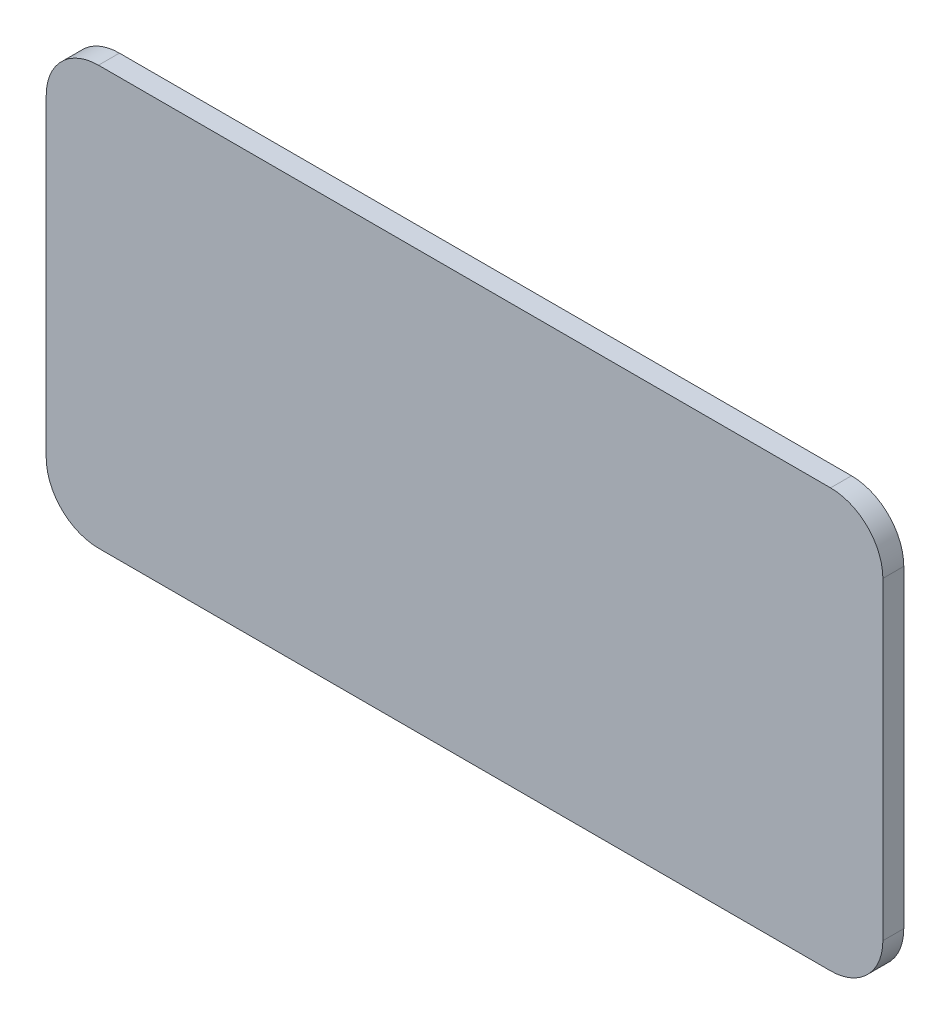
ISO-10303-21;
HEADER;
FILE_DESCRIPTION(('STEP AP214'),'2;1');
FILE_NAME('part.step','',(''),(''),'','','');
FILE_SCHEMA(('AUTOMOTIVE_DESIGN { 1 0 10303 214 1 1 1 1 }'));
ENDSEC;
DATA;
#1=APPLICATION_CONTEXT('core data for automotive mechanical design processes');
#2=APPLICATION_PROTOCOL_DEFINITION('international standard','automotive_design',2000,#1);
#3=PRODUCT_CONTEXT('',#1,'mechanical');
#4=PRODUCT('Part','Part','',(#3));
#5=PRODUCT_RELATED_PRODUCT_CATEGORY('part','',(#4));
#6=PRODUCT_DEFINITION_FORMATION('','',#4);
#7=PRODUCT_DEFINITION_CONTEXT('part definition',#1,'design');
#8=PRODUCT_DEFINITION('design','',#6,#7);
#9=PRODUCT_DEFINITION_SHAPE('','',#8);
#10=(LENGTH_UNIT() NAMED_UNIT(*) SI_UNIT(.MILLI.,.METRE.));
#11=(NAMED_UNIT(*) PLANE_ANGLE_UNIT() SI_UNIT($,.RADIAN.));
#12=(NAMED_UNIT(*) SI_UNIT($,.STERADIAN.) SOLID_ANGLE_UNIT());
#13=UNCERTAINTY_MEASURE_WITH_UNIT(LENGTH_MEASURE(1.E-05),#10,'distance_accuracy_value','');
#14=(GEOMETRIC_REPRESENTATION_CONTEXT(3) GLOBAL_UNCERTAINTY_ASSIGNED_CONTEXT((#13)) GLOBAL_UNIT_ASSIGNED_CONTEXT((#10,
#11,#12)) REPRESENTATION_CONTEXT('',''));
#15=CARTESIAN_POINT('',(0.,0.,0.));
#16=DIRECTION('',(0.,0.,1.));
#17=DIRECTION('',(1.,0.,0.));
#18=AXIS2_PLACEMENT_3D('',#15,#16,#17);
#19=CARTESIAN_POINT('',(40.,-15.,2.));
#20=DIRECTION('',(-1.,0.,0.));
#21=DIRECTION('',(0.,0.,1.));
#22=AXIS2_PLACEMENT_3D('',#19,#20,#21);
#23=PLANE('',#22);
#24=DIRECTION('',(0.,1.,0.));
#25=VECTOR('',#24,1.);
#26=CARTESIAN_POINT('',(40.,-15.,0.));
#27=LINE('',#26,#25);
#28=CARTESIAN_POINT('',(40.,-15.,0.));
#29=VERTEX_POINT('',#28);
#30=CARTESIAN_POINT('',(40.,15.,0.));
#31=VERTEX_POINT('',#30);
#32=EDGE_CURVE('E146',#29,#31,#27,.T.);
#33=ORIENTED_EDGE('',*,*,#32,.T.);
#34=DIRECTION('',(0.,0.,-1.));
#35=VECTOR('',#34,1.);
#36=CARTESIAN_POINT('',(40.,15.,2.));
#37=LINE('',#36,#35);
#38=CARTESIAN_POINT('',(40.,15.,2.));
#39=VERTEX_POINT('',#38);
#40=EDGE_CURVE('E67',#31,#39,#37,.F.);
#41=ORIENTED_EDGE('',*,*,#40,.T.);
#42=DIRECTION('',(0.,1.,0.));
#43=VECTOR('',#42,1.);
#44=CARTESIAN_POINT('',(40.,-15.,2.));
#45=LINE('',#44,#43);
#46=CARTESIAN_POINT('',(40.,-15.,2.));
#47=VERTEX_POINT('',#46);
#48=EDGE_CURVE('E164',#47,#39,#45,.T.);
#49=ORIENTED_EDGE('',*,*,#48,.F.);
#50=DIRECTION('',(0.,0.,-1.));
#51=VECTOR('',#50,1.);
#52=CARTESIAN_POINT('',(40.,-15.,2.));
#53=LINE('',#52,#51);
#54=EDGE_CURVE('E145',#47,#29,#53,.T.);
#55=ORIENTED_EDGE('',*,*,#54,.T.);
#56=EDGE_LOOP('',(#33,#41,#49,#55));
#57=FACE_BOUND('',#56,.T.);
#58=ADVANCED_FACE('F43',(#57),#23,.F.);
#59=CARTESIAN_POINT('',(-40.,20.,2.));
#60=DIRECTION('',(0.,-1.,0.));
#61=DIRECTION('',(0.,0.,-1.));
#62=AXIS2_PLACEMENT_3D('',#59,#60,#61);
#63=PLANE('',#62);
#64=DIRECTION('',(-1.,0.,0.));
#65=VECTOR('',#64,1.);
#66=CARTESIAN_POINT('',(-40.,20.,2.));
#67=LINE('',#66,#65);
#68=CARTESIAN_POINT('',(35.,20.,2.));
#69=VERTEX_POINT('',#68);
#70=CARTESIAN_POINT('',(-35.,20.,2.));
#71=VERTEX_POINT('',#70);
#72=EDGE_CURVE('E118',#69,#71,#67,.T.);
#73=ORIENTED_EDGE('',*,*,#72,.F.);
#74=DIRECTION('',(0.,0.,-1.));
#75=VECTOR('',#74,1.);
#76=CARTESIAN_POINT('',(35.,20.,2.));
#77=LINE('',#76,#75);
#78=CARTESIAN_POINT('',(35.,20.,0.));
#79=VERTEX_POINT('',#78);
#80=EDGE_CURVE('E176',#69,#79,#77,.T.);
#81=ORIENTED_EDGE('',*,*,#80,.T.);
#82=DIRECTION('',(-1.,0.,0.));
#83=VECTOR('',#82,1.);
#84=CARTESIAN_POINT('',(-40.,20.,0.));
#85=LINE('',#84,#83);
#86=CARTESIAN_POINT('',(-35.,20.,0.));
#87=VERTEX_POINT('',#86);
#88=EDGE_CURVE('E149',#79,#87,#85,.T.);
#89=ORIENTED_EDGE('',*,*,#88,.T.);
#90=DIRECTION('',(0.,0.,-1.));
#91=VECTOR('',#90,1.);
#92=CARTESIAN_POINT('',(-35.,20.,2.));
#93=LINE('',#92,#91);
#94=EDGE_CURVE('E128',#87,#71,#93,.F.);
#95=ORIENTED_EDGE('',*,*,#94,.T.);
#96=EDGE_LOOP('',(#73,#81,#89,#95));
#97=FACE_BOUND('',#96,.T.);
#98=ADVANCED_FACE('F196',(#97),#63,.F.);
#99=CARTESIAN_POINT('',(-40.,-15.,2.));
#100=DIRECTION('',(1.,0.,0.));
#101=DIRECTION('',(0.,0.,-1.));
#102=AXIS2_PLACEMENT_3D('',#99,#100,#101);
#103=PLANE('',#102);
#104=DIRECTION('',(0.,-1.,0.));
#105=VECTOR('',#104,1.);
#106=CARTESIAN_POINT('',(-40.,-15.,2.));
#107=LINE('',#106,#105);
#108=CARTESIAN_POINT('',(-40.,15.,2.));
#109=VERTEX_POINT('',#108);
#110=CARTESIAN_POINT('',(-40.,-15.,2.));
#111=VERTEX_POINT('',#110);
#112=EDGE_CURVE('E109',#109,#111,#107,.T.);
#113=ORIENTED_EDGE('',*,*,#112,.F.);
#114=DIRECTION('',(0.,0.,-1.));
#115=VECTOR('',#114,1.);
#116=CARTESIAN_POINT('',(-40.,15.,2.));
#117=LINE('',#116,#115);
#118=CARTESIAN_POINT('',(-40.,15.,0.));
#119=VERTEX_POINT('',#118);
#120=EDGE_CURVE('E11',#109,#119,#117,.T.);
#121=ORIENTED_EDGE('',*,*,#120,.T.);
#122=DIRECTION('',(0.,-1.,0.));
#123=VECTOR('',#122,1.);
#124=CARTESIAN_POINT('',(-40.,-15.,0.));
#125=LINE('',#124,#123);
#126=CARTESIAN_POINT('',(-40.,-15.,0.));
#127=VERTEX_POINT('',#126);
#128=EDGE_CURVE('E124',#119,#127,#125,.T.);
#129=ORIENTED_EDGE('',*,*,#128,.T.);
#130=DIRECTION('',(0.,0.,-1.));
#131=VECTOR('',#130,1.);
#132=CARTESIAN_POINT('',(-40.,-15.,2.));
#133=LINE('',#132,#131);
#134=EDGE_CURVE('E121',#111,#127,#133,.T.);
#135=ORIENTED_EDGE('',*,*,#134,.F.);
#136=EDGE_LOOP('',(#113,#121,#129,#135));
#137=FACE_BOUND('',#136,.T.);
#138=ADVANCED_FACE('F122',(#137),#103,.F.);
#139=CARTESIAN_POINT('',(-35.,-15.,2.));
#140=DIRECTION('',(0.,0.,-1.));
#141=DIRECTION('',(-1.,0.,0.));
#142=AXIS2_PLACEMENT_3D('',#139,#140,#141);
#143=CYLINDRICAL_SURFACE('',#142,5.);
#144=CARTESIAN_POINT('',(-35.,-15.,0.));
#145=DIRECTION('',(0.,0.,1.));
#146=DIRECTION('',(-1.,0.,0.));
#147=AXIS2_PLACEMENT_3D('',#144,#145,#146);
#148=CIRCLE('',#147,5.);
#149=CARTESIAN_POINT('',(-35.,-20.,0.));
#150=VERTEX_POINT('',#149);
#151=EDGE_CURVE('E155',#127,#150,#148,.T.);
#152=ORIENTED_EDGE('',*,*,#151,.T.);
#153=DIRECTION('',(0.,0.,-1.));
#154=VECTOR('',#153,1.);
#155=CARTESIAN_POINT('',(-35.,-20.,2.));
#156=LINE('',#155,#154);
#157=CARTESIAN_POINT('',(-35.,-20.,2.));
#158=VERTEX_POINT('',#157);
#159=EDGE_CURVE('E129',#158,#150,#156,.T.);
#160=ORIENTED_EDGE('',*,*,#159,.F.);
#161=CARTESIAN_POINT('',(-35.,-15.,2.));
#162=DIRECTION('',(0.,0.,1.));
#163=DIRECTION('',(-1.,0.,0.));
#164=AXIS2_PLACEMENT_3D('',#161,#162,#163);
#165=CIRCLE('',#164,5.);
#166=EDGE_CURVE('E113',#111,#158,#165,.T.);
#167=ORIENTED_EDGE('',*,*,#166,.F.);
#168=ORIENTED_EDGE('',*,*,#134,.T.);
#169=EDGE_LOOP('',(#152,#160,#167,#168));
#170=FACE_BOUND('',#169,.T.);
#171=ADVANCED_FACE('F131',(#170),#143,.T.);
#172=CARTESIAN_POINT('',(-35.,-20.,2.));
#173=DIRECTION('',(0.,1.,0.));
#174=DIRECTION('',(0.,0.,1.));
#175=AXIS2_PLACEMENT_3D('',#172,#173,#174);
#176=PLANE('',#175);
#177=DIRECTION('',(1.,0.,0.));
#178=VECTOR('',#177,1.);
#179=CARTESIAN_POINT('',(-35.,-20.,0.));
#180=LINE('',#179,#178);
#181=CARTESIAN_POINT('',(35.,-20.,0.));
#182=VERTEX_POINT('',#181);
#183=EDGE_CURVE('E158',#150,#182,#180,.T.);
#184=ORIENTED_EDGE('',*,*,#183,.T.);
#185=DIRECTION('',(0.,0.,-1.));
#186=VECTOR('',#185,1.);
#187=CARTESIAN_POINT('',(35.,-20.,2.));
#188=LINE('',#187,#186);
#189=CARTESIAN_POINT('',(35.,-20.,2.));
#190=VERTEX_POINT('',#189);
#191=EDGE_CURVE('E168',#190,#182,#188,.T.);
#192=ORIENTED_EDGE('',*,*,#191,.F.);
#193=DIRECTION('',(1.,0.,0.));
#194=VECTOR('',#193,1.);
#195=CARTESIAN_POINT('',(-35.,-20.,2.));
#196=LINE('',#195,#194);
#197=EDGE_CURVE('E135',#158,#190,#196,.T.);
#198=ORIENTED_EDGE('',*,*,#197,.F.);
#199=ORIENTED_EDGE('',*,*,#159,.T.);
#200=EDGE_LOOP('',(#184,#192,#198,#199));
#201=FACE_BOUND('',#200,.T.);
#202=ADVANCED_FACE('F212',(#201),#176,.F.);
#203=CARTESIAN_POINT('',(35.,-15.,2.));
#204=DIRECTION('',(0.,0.,-1.));
#205=DIRECTION('',(-1.,0.,0.));
#206=AXIS2_PLACEMENT_3D('',#203,#204,#205);
#207=CYLINDRICAL_SURFACE('',#206,5.);
#208=CARTESIAN_POINT('',(35.,-15.,0.));
#209=DIRECTION('',(0.,0.,1.));
#210=DIRECTION('',(1.,0.,0.));
#211=AXIS2_PLACEMENT_3D('',#208,#209,#210);
#212=CIRCLE('',#211,5.);
#213=EDGE_CURVE('E161',#182,#29,#212,.T.);
#214=ORIENTED_EDGE('',*,*,#213,.T.);
#215=ORIENTED_EDGE('',*,*,#54,.F.);
#216=CARTESIAN_POINT('',(35.,-15.,2.));
#217=DIRECTION('',(0.,0.,1.));
#218=DIRECTION('',(1.,0.,0.));
#219=AXIS2_PLACEMENT_3D('',#216,#217,#218);
#220=CIRCLE('',#219,5.);
#221=EDGE_CURVE('E139',#190,#47,#220,.T.);
#222=ORIENTED_EDGE('',*,*,#221,.F.);
#223=ORIENTED_EDGE('',*,*,#191,.T.);
#224=EDGE_LOOP('',(#214,#215,#222,#223));
#225=FACE_BOUND('',#224,.T.);
#226=ADVANCED_FACE('F208',(#225),#207,.T.);
#227=CARTESIAN_POINT('',(-35.,-15.,2.));
#228=DIRECTION('',(0.,0.,-1.));
#229=DIRECTION('',(-1.,0.,0.));
#230=AXIS2_PLACEMENT_3D('',#227,#228,#229);
#231=PLANE('',#230);
#232=ORIENTED_EDGE('',*,*,#48,.T.);
#233=CARTESIAN_POINT('',(35.,15.,2.));
#234=DIRECTION('',(0.,0.,-1.));
#235=DIRECTION('',(-1.,0.,0.));
#236=AXIS2_PLACEMENT_3D('',#233,#234,#235);
#237=CIRCLE('',#236,5.);
#238=EDGE_CURVE('E52',#39,#69,#237,.F.);
#239=ORIENTED_EDGE('',*,*,#238,.T.);
#240=ORIENTED_EDGE('',*,*,#72,.T.);
#241=CARTESIAN_POINT('',(-35.,15.,2.));
#242=DIRECTION('',(0.,0.,-1.));
#243=DIRECTION('',(-1.,0.,0.));
#244=AXIS2_PLACEMENT_3D('',#241,#242,#243);
#245=CIRCLE('',#244,5.);
#246=EDGE_CURVE('E59',#71,#109,#245,.F.);
#247=ORIENTED_EDGE('',*,*,#246,.T.);
#248=ORIENTED_EDGE('',*,*,#112,.T.);
#249=ORIENTED_EDGE('',*,*,#166,.T.);
#250=ORIENTED_EDGE('',*,*,#197,.T.);
#251=ORIENTED_EDGE('',*,*,#221,.T.);
#252=EDGE_LOOP('',(#232,#239,#240,#247,#248,#249,#250,#251));
#253=FACE_BOUND('',#252,.T.);
#254=ADVANCED_FACE('F111',(#253),#231,.F.);
#255=CARTESIAN_POINT('',(-35.,-15.,0.));
#256=DIRECTION('',(0.,0.,-1.));
#257=DIRECTION('',(-1.,0.,0.));
#258=AXIS2_PLACEMENT_3D('',#255,#256,#257);
#259=PLANE('',#258);
#260=ORIENTED_EDGE('',*,*,#88,.F.);
#261=CARTESIAN_POINT('',(35.,15.,0.));
#262=DIRECTION('',(0.,0.,-1.));
#263=DIRECTION('',(-1.,0.,0.));
#264=AXIS2_PLACEMENT_3D('',#261,#262,#263);
#265=CIRCLE('',#264,5.);
#266=EDGE_CURVE('E183',#79,#31,#265,.T.);
#267=ORIENTED_EDGE('',*,*,#266,.T.);
#268=ORIENTED_EDGE('',*,*,#32,.F.);
#269=ORIENTED_EDGE('',*,*,#213,.F.);
#270=ORIENTED_EDGE('',*,*,#183,.F.);
#271=ORIENTED_EDGE('',*,*,#151,.F.);
#272=ORIENTED_EDGE('',*,*,#128,.F.);
#273=CARTESIAN_POINT('',(-35.,15.,0.));
#274=DIRECTION('',(0.,0.,-1.));
#275=DIRECTION('',(-1.,0.,0.));
#276=AXIS2_PLACEMENT_3D('',#273,#274,#275);
#277=CIRCLE('',#276,5.);
#278=EDGE_CURVE('E180',#119,#87,#277,.T.);
#279=ORIENTED_EDGE('',*,*,#278,.T.);
#280=EDGE_LOOP('',(#260,#267,#268,#269,#270,#271,#272,#279));
#281=FACE_BOUND('',#280,.T.);
#282=ADVANCED_FACE('F203',(#281),#259,.T.);
#283=CARTESIAN_POINT('',(35.,15.,2.));
#284=DIRECTION('',(0.,0.,-1.));
#285=DIRECTION('',(-1.,0.,0.));
#286=AXIS2_PLACEMENT_3D('',#283,#284,#285);
#287=CYLINDRICAL_SURFACE('',#286,5.);
#288=ORIENTED_EDGE('',*,*,#238,.F.);
#289=ORIENTED_EDGE('',*,*,#40,.F.);
#290=ORIENTED_EDGE('',*,*,#266,.F.);
#291=ORIENTED_EDGE('',*,*,#80,.F.);
#292=EDGE_LOOP('',(#288,#289,#290,#291));
#293=FACE_BOUND('',#292,.T.);
#294=ADVANCED_FACE('F200',(#293),#287,.T.);
#295=CARTESIAN_POINT('',(-35.,15.,2.));
#296=DIRECTION('',(0.,0.,-1.));
#297=DIRECTION('',(-1.,0.,0.));
#298=AXIS2_PLACEMENT_3D('',#295,#296,#297);
#299=CYLINDRICAL_SURFACE('',#298,5.);
#300=ORIENTED_EDGE('',*,*,#246,.F.);
#301=ORIENTED_EDGE('',*,*,#94,.F.);
#302=ORIENTED_EDGE('',*,*,#278,.F.);
#303=ORIENTED_EDGE('',*,*,#120,.F.);
#304=EDGE_LOOP('',(#300,#301,#302,#303));
#305=FACE_BOUND('',#304,.T.);
#306=ADVANCED_FACE('F45',(#305),#299,.T.);
#307=CLOSED_SHELL('',(#58,#98,#138,#171,#202,#226,#254,#282,#294,#306));
#308=MANIFOLD_SOLID_BREP('B2',#307);
#309=ADVANCED_BREP_SHAPE_REPRESENTATION('',(#18,#308),#14);
#310=SHAPE_DEFINITION_REPRESENTATION(#9,#309);
ENDSEC;
END-ISO-10303-21;
